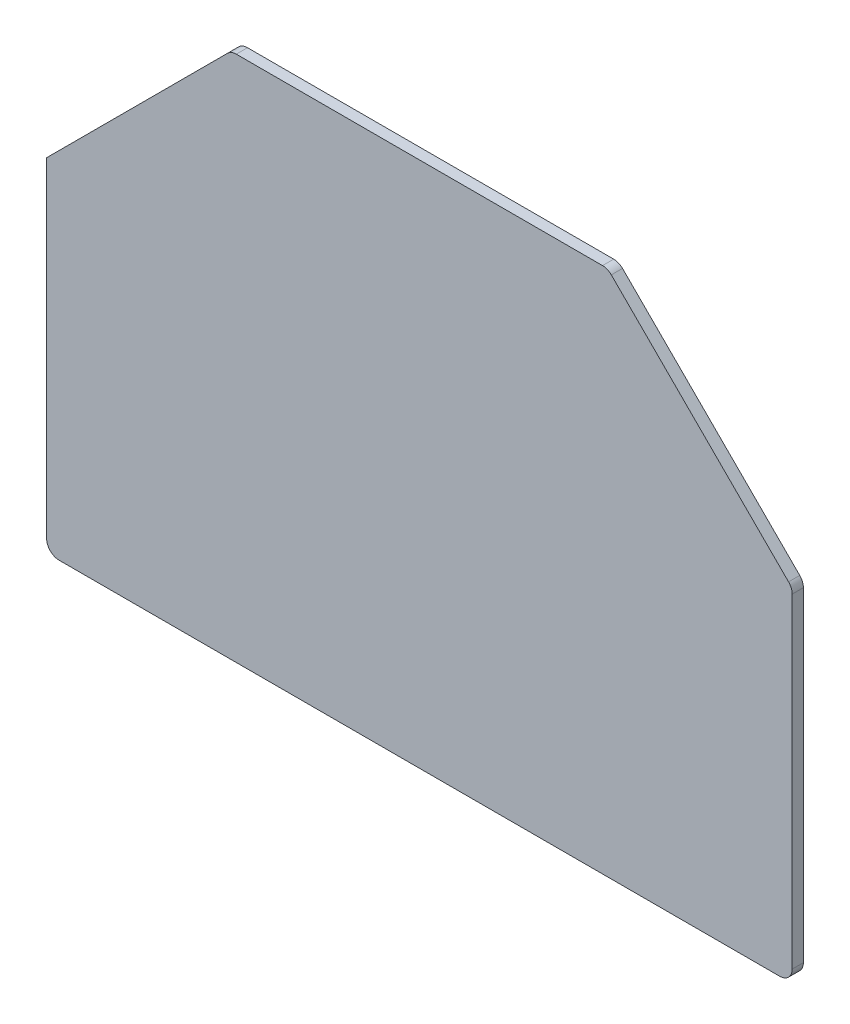
ISO-10303-21;
HEADER;
FILE_DESCRIPTION(('STEP AP214'),'2;1');
FILE_NAME('part.step','',(''),(''),'','','');
FILE_SCHEMA(('AUTOMOTIVE_DESIGN { 1 0 10303 214 1 1 1 1 }'));
ENDSEC;
DATA;
#1=APPLICATION_CONTEXT('core data for automotive mechanical design processes');
#2=APPLICATION_PROTOCOL_DEFINITION('international standard','automotive_design',2000,#1);
#3=PRODUCT_CONTEXT('',#1,'mechanical');
#4=PRODUCT('Part','Part','',(#3));
#5=PRODUCT_RELATED_PRODUCT_CATEGORY('part','',(#4));
#6=PRODUCT_DEFINITION_FORMATION('','',#4);
#7=PRODUCT_DEFINITION_CONTEXT('part definition',#1,'design');
#8=PRODUCT_DEFINITION('design','',#6,#7);
#9=PRODUCT_DEFINITION_SHAPE('','',#8);
#10=(LENGTH_UNIT() NAMED_UNIT(*) SI_UNIT(.MILLI.,.METRE.));
#11=(NAMED_UNIT(*) PLANE_ANGLE_UNIT() SI_UNIT($,.RADIAN.));
#12=(NAMED_UNIT(*) SI_UNIT($,.STERADIAN.) SOLID_ANGLE_UNIT());
#13=UNCERTAINTY_MEASURE_WITH_UNIT(LENGTH_MEASURE(1.E-05),#10,'distance_accuracy_value','');
#14=(GEOMETRIC_REPRESENTATION_CONTEXT(3) GLOBAL_UNCERTAINTY_ASSIGNED_CONTEXT((#13)) GLOBAL_UNIT_ASSIGNED_CONTEXT((#10,
#11,#12)) REPRESENTATION_CONTEXT('',''));
#15=CARTESIAN_POINT('',(0.,0.,0.));
#16=DIRECTION('',(0.,0.,1.));
#17=DIRECTION('',(1.,0.,0.));
#18=AXIS2_PLACEMENT_3D('',#15,#16,#17);
#19=CARTESIAN_POINT('',(0.,0.,4.5));
#20=DIRECTION('',(1.,0.,0.));
#21=DIRECTION('',(0.,0.,-1.));
#22=AXIS2_PLACEMENT_3D('',#19,#20,#21);
#23=PLANE('',#22);
#24=DIRECTION('',(0.,-1.,0.));
#25=VECTOR('',#24,1.);
#26=CARTESIAN_POINT('',(0.,0.,0.));
#27=LINE('',#26,#25);
#28=CARTESIAN_POINT('',(0.,137.753787975412,0.));
#29=VERTEX_POINT('',#28);
#30=CARTESIAN_POINT('',(0.,5.,0.));
#31=VERTEX_POINT('',#30);
#32=EDGE_CURVE('E173',#29,#31,#27,.T.);
#33=ORIENTED_EDGE('',*,*,#32,.T.);
#34=DIRECTION('',(0.,0.,-1.));
#35=VECTOR('',#34,1.);
#36=CARTESIAN_POINT('',(0.,5.,4.5));
#37=LINE('',#36,#35);
#38=CARTESIAN_POINT('',(0.,5.,4.5));
#39=VERTEX_POINT('',#38);
#40=EDGE_CURVE('E152',#31,#39,#37,.F.);
#41=ORIENTED_EDGE('',*,*,#40,.T.);
#42=DIRECTION('',(0.,-1.,0.));
#43=VECTOR('',#42,1.);
#44=CARTESIAN_POINT('',(0.,0.,4.5));
#45=LINE('',#44,#43);
#46=CARTESIAN_POINT('',(0.,137.753787975412,4.5));
#47=VERTEX_POINT('',#46);
#48=EDGE_CURVE('E133',#47,#39,#45,.T.);
#49=ORIENTED_EDGE('',*,*,#48,.F.);
#50=DIRECTION('',(0.,0.,-1.));
#51=VECTOR('',#50,1.);
#52=CARTESIAN_POINT('',(0.,137.753787975412,4.5));
#53=LINE('',#52,#51);
#54=EDGE_CURVE('E138',#47,#29,#53,.T.);
#55=ORIENTED_EDGE('',*,*,#54,.T.);
#56=EDGE_LOOP('',(#33,#41,#49,#55));
#57=FACE_BOUND('',#56,.T.);
#58=ADVANCED_FACE('F45',(#57),#23,.F.);
#59=CARTESIAN_POINT('',(0.,0.,4.5));
#60=DIRECTION('',(0.,1.,0.));
#61=DIRECTION('',(0.,0.,1.));
#62=AXIS2_PLACEMENT_3D('',#59,#60,#61);
#63=PLANE('',#62);
#64=DIRECTION('',(1.,0.,0.));
#65=VECTOR('',#64,1.);
#66=CARTESIAN_POINT('',(0.,0.,4.5));
#67=LINE('',#66,#65);
#68=CARTESIAN_POINT('',(5.,0.,4.5));
#69=VERTEX_POINT('',#68);
#70=CARTESIAN_POINT('',(295.,0.,4.5));
#71=VERTEX_POINT('',#70);
#72=EDGE_CURVE('E154',#69,#71,#67,.T.);
#73=ORIENTED_EDGE('',*,*,#72,.F.);
#74=DIRECTION('',(0.,0.,-1.));
#75=VECTOR('',#74,1.);
#76=CARTESIAN_POINT('',(5.,0.,4.5));
#77=LINE('',#76,#75);
#78=CARTESIAN_POINT('',(5.,0.,0.));
#79=VERTEX_POINT('',#78);
#80=EDGE_CURVE('E192',#69,#79,#77,.T.);
#81=ORIENTED_EDGE('',*,*,#80,.T.);
#82=DIRECTION('',(1.,0.,0.));
#83=VECTOR('',#82,1.);
#84=CARTESIAN_POINT('',(0.,0.,0.));
#85=LINE('',#84,#83);
#86=CARTESIAN_POINT('',(295.,0.,0.));
#87=VERTEX_POINT('',#86);
#88=EDGE_CURVE('E176',#79,#87,#85,.T.);
#89=ORIENTED_EDGE('',*,*,#88,.T.);
#90=DIRECTION('',(0.,0.,-1.));
#91=VECTOR('',#90,1.);
#92=CARTESIAN_POINT('',(295.,0.,4.5));
#93=LINE('',#92,#91);
#94=EDGE_CURVE('E149',#87,#71,#93,.F.);
#95=ORIENTED_EDGE('',*,*,#94,.T.);
#96=EDGE_LOOP('',(#73,#81,#89,#95));
#97=FACE_BOUND('',#96,.T.);
#98=ADVANCED_FACE('F261',(#97),#63,.F.);
#99=CARTESIAN_POINT('',(300.,0.,4.5));
#100=DIRECTION('',(-1.,0.,0.));
#101=DIRECTION('',(0.,0.,1.));
#102=AXIS2_PLACEMENT_3D('',#99,#100,#101);
#103=PLANE('',#102);
#104=DIRECTION('',(0.,1.,0.));
#105=VECTOR('',#104,1.);
#106=CARTESIAN_POINT('',(300.,0.,4.5));
#107=LINE('',#106,#105);
#108=CARTESIAN_POINT('',(300.,5.,4.5));
#109=VERTEX_POINT('',#108);
#110=CARTESIAN_POINT('',(300.,135.682720163547,4.5));
#111=VERTEX_POINT('',#110);
#112=EDGE_CURVE('E159',#109,#111,#107,.T.);
#113=ORIENTED_EDGE('',*,*,#112,.F.);
#114=DIRECTION('',(0.,0.,-1.));
#115=VECTOR('',#114,1.);
#116=CARTESIAN_POINT('',(300.,5.,4.5));
#117=LINE('',#116,#115);
#118=CARTESIAN_POINT('',(300.,5.,0.));
#119=VERTEX_POINT('',#118);
#120=EDGE_CURVE('E230',#109,#119,#117,.T.);
#121=ORIENTED_EDGE('',*,*,#120,.T.);
#122=DIRECTION('',(0.,1.,0.));
#123=VECTOR('',#122,1.);
#124=CARTESIAN_POINT('',(300.,0.,0.));
#125=LINE('',#124,#123);
#126=CARTESIAN_POINT('',(300.,135.682720163547,0.));
#127=VERTEX_POINT('',#126);
#128=EDGE_CURVE('E180',#119,#127,#125,.T.);
#129=ORIENTED_EDGE('',*,*,#128,.T.);
#130=DIRECTION('',(0.,0.,-1.));
#131=VECTOR('',#130,1.);
#132=CARTESIAN_POINT('',(300.,135.682720163547,4.5));
#133=LINE('',#132,#131);
#134=EDGE_CURVE('E227',#127,#111,#133,.F.);
#135=ORIENTED_EDGE('',*,*,#134,.T.);
#136=EDGE_LOOP('',(#113,#121,#129,#135));
#137=FACE_BOUND('',#136,.T.);
#138=ADVANCED_FACE('F266',(#137),#103,.F.);
#139=CARTESIAN_POINT('',(225.753787975413,212.,4.5));
#140=DIRECTION('',(-0.707106781186549,-0.707106781186546,0.));
#141=DIRECTION('',(0.707106781186546,-0.707106781186549,0.));
#142=AXIS2_PLACEMENT_3D('',#139,#140,#141);
#143=PLANE('',#142);
#144=DIRECTION('',(-0.707106781186546,0.707106781186549,0.));
#145=VECTOR('',#144,1.);
#146=CARTESIAN_POINT('',(225.753787975413,212.,4.5));
#147=LINE('',#146,#145);
#148=CARTESIAN_POINT('',(298.535533905933,139.21825406948,4.5));
#149=VERTEX_POINT('',#148);
#150=CARTESIAN_POINT('',(227.21825406948,210.535533905933,4.5));
#151=VERTEX_POINT('',#150);
#152=EDGE_CURVE('E167',#149,#151,#147,.T.);
#153=ORIENTED_EDGE('',*,*,#152,.F.);
#154=DIRECTION('',(0.,0.,-1.));
#155=VECTOR('',#154,1.);
#156=CARTESIAN_POINT('',(298.535533905933,139.21825406948,4.5));
#157=LINE('',#156,#155);
#158=CARTESIAN_POINT('',(298.535533905933,139.21825406948,0.));
#159=VERTEX_POINT('',#158);
#160=EDGE_CURVE('E237',#149,#159,#157,.T.);
#161=ORIENTED_EDGE('',*,*,#160,.T.);
#162=DIRECTION('',(-0.707106781186546,0.707106781186549,0.));
#163=VECTOR('',#162,1.);
#164=CARTESIAN_POINT('',(225.753787975413,212.,0.));
#165=LINE('',#164,#163);
#166=CARTESIAN_POINT('',(227.21825406948,210.535533905933,0.));
#167=VERTEX_POINT('',#166);
#168=EDGE_CURVE('E184',#159,#167,#165,.T.);
#169=ORIENTED_EDGE('',*,*,#168,.T.);
#170=DIRECTION('',(0.,0.,-1.));
#171=VECTOR('',#170,1.);
#172=CARTESIAN_POINT('',(227.21825406948,210.535533905933,4.5));
#173=LINE('',#172,#171);
#174=EDGE_CURVE('E234',#167,#151,#173,.F.);
#175=ORIENTED_EDGE('',*,*,#174,.T.);
#176=EDGE_LOOP('',(#153,#161,#169,#175));
#177=FACE_BOUND('',#176,.T.);
#178=ADVANCED_FACE('F289',(#177),#143,.F.);
#179=CARTESIAN_POINT('',(74.2462120245874,212.,4.5));
#180=DIRECTION('',(0.,-1.,0.));
#181=DIRECTION('',(1.,0.,0.));
#182=AXIS2_PLACEMENT_3D('',#179,#180,#181);
#183=PLANE('',#182);
#184=DIRECTION('',(-1.,0.,0.));
#185=VECTOR('',#184,1.);
#186=CARTESIAN_POINT('',(74.2462120245874,212.,4.5));
#187=LINE('',#186,#185);
#188=CARTESIAN_POINT('',(223.682720163547,212.,4.5));
#189=VERTEX_POINT('',#188);
#190=CARTESIAN_POINT('',(76.3172798364529,212.,4.5));
#191=VERTEX_POINT('',#190);
#192=EDGE_CURVE('E139',#189,#191,#187,.T.);
#193=ORIENTED_EDGE('',*,*,#192,.F.);
#194=DIRECTION('',(0.,0.,-1.));
#195=VECTOR('',#194,1.);
#196=CARTESIAN_POINT('',(223.682720163547,212.,4.5));
#197=LINE('',#196,#195);
#198=CARTESIAN_POINT('',(223.682720163547,212.,0.));
#199=VERTEX_POINT('',#198);
#200=EDGE_CURVE('E54',#189,#199,#197,.T.);
#201=ORIENTED_EDGE('',*,*,#200,.T.);
#202=DIRECTION('',(-1.,0.,0.));
#203=VECTOR('',#202,1.);
#204=CARTESIAN_POINT('',(74.2462120245874,212.,0.));
#205=LINE('',#204,#203);
#206=CARTESIAN_POINT('',(76.3172798364529,212.,0.));
#207=VERTEX_POINT('',#206);
#208=EDGE_CURVE('E161',#199,#207,#205,.T.);
#209=ORIENTED_EDGE('',*,*,#208,.T.);
#210=DIRECTION('',(0.,0.,-1.));
#211=VECTOR('',#210,1.);
#212=CARTESIAN_POINT('',(76.3172798364529,212.,4.5));
#213=LINE('',#212,#211);
#214=EDGE_CURVE('E69',#207,#191,#213,.F.);
#215=ORIENTED_EDGE('',*,*,#214,.T.);
#216=EDGE_LOOP('',(#193,#201,#209,#215));
#217=FACE_BOUND('',#216,.T.);
#218=ADVANCED_FACE('F246',(#217),#183,.F.);
#219=CARTESIAN_POINT('',(0.,137.753787975412,4.5));
#220=DIRECTION('',(0.707106781186549,-0.707106781186547,0.));
#221=DIRECTION('',(0.707106781186547,0.707106781186549,0.));
#222=AXIS2_PLACEMENT_3D('',#219,#220,#221);
#223=PLANE('',#222);
#224=DIRECTION('',(-0.707106781186546,-0.707106781186548,0.));
#225=VECTOR('',#224,1.);
#226=CARTESIAN_POINT('',(0.,137.753787975412,4.5));
#227=LINE('',#226,#225);
#228=CARTESIAN_POINT('',(72.7817459305201,210.535533905933,4.5));
#229=VERTEX_POINT('',#228);
#230=EDGE_CURVE('E129',#229,#47,#227,.T.);
#231=ORIENTED_EDGE('',*,*,#230,.F.);
#232=DIRECTION('',(0.,0.,-1.));
#233=VECTOR('',#232,1.);
#234=CARTESIAN_POINT('',(72.7817459305201,210.535533905933,4.5));
#235=LINE('',#234,#233);
#236=CARTESIAN_POINT('',(72.7817459305201,210.535533905933,0.));
#237=VERTEX_POINT('',#236);
#238=EDGE_CURVE('E11',#229,#237,#235,.T.);
#239=ORIENTED_EDGE('',*,*,#238,.T.);
#240=DIRECTION('',(-0.707106781186546,-0.707106781186548,0.));
#241=VECTOR('',#240,1.);
#242=CARTESIAN_POINT('',(0.,137.753787975412,0.));
#243=LINE('',#242,#241);
#244=EDGE_CURVE('E144',#237,#29,#243,.T.);
#245=ORIENTED_EDGE('',*,*,#244,.T.);
#246=ORIENTED_EDGE('',*,*,#54,.F.);
#247=EDGE_LOOP('',(#231,#239,#245,#246));
#248=FACE_BOUND('',#247,.T.);
#249=ADVANCED_FACE('F142',(#248),#223,.F.);
#250=CARTESIAN_POINT('',(0.,0.,4.5));
#251=DIRECTION('',(0.,0.,-1.));
#252=DIRECTION('',(-1.,0.,0.));
#253=AXIS2_PLACEMENT_3D('',#250,#251,#252);
#254=PLANE('',#253);
#255=ORIENTED_EDGE('',*,*,#48,.T.);
#256=CARTESIAN_POINT('',(5.,5.,4.5));
#257=DIRECTION('',(0.,0.,-1.));
#258=DIRECTION('',(-1.,0.,0.));
#259=AXIS2_PLACEMENT_3D('',#256,#257,#258);
#260=CIRCLE('',#259,5.);
#261=EDGE_CURVE('E224',#39,#69,#260,.F.);
#262=ORIENTED_EDGE('',*,*,#261,.T.);
#263=ORIENTED_EDGE('',*,*,#72,.T.);
#264=CARTESIAN_POINT('',(295.,5.,4.5));
#265=DIRECTION('',(0.,0.,-1.));
#266=DIRECTION('',(-1.,0.,0.));
#267=AXIS2_PLACEMENT_3D('',#264,#265,#266);
#268=CIRCLE('',#267,5.);
#269=EDGE_CURVE('E221',#71,#109,#268,.F.);
#270=ORIENTED_EDGE('',*,*,#269,.T.);
#271=ORIENTED_EDGE('',*,*,#112,.T.);
#272=CARTESIAN_POINT('',(295.,135.682720163547,4.5));
#273=DIRECTION('',(0.,0.,-1.));
#274=DIRECTION('',(-1.,0.,0.));
#275=AXIS2_PLACEMENT_3D('',#272,#273,#274);
#276=CIRCLE('',#275,5.);
#277=EDGE_CURVE('E218',#111,#149,#276,.F.);
#278=ORIENTED_EDGE('',*,*,#277,.T.);
#279=ORIENTED_EDGE('',*,*,#152,.T.);
#280=CARTESIAN_POINT('',(223.682720163547,207.,4.5));
#281=DIRECTION('',(0.,0.,-1.));
#282=DIRECTION('',(-1.,0.,0.));
#283=AXIS2_PLACEMENT_3D('',#280,#281,#282);
#284=CIRCLE('',#283,5.);
#285=EDGE_CURVE('E215',#151,#189,#284,.F.);
#286=ORIENTED_EDGE('',*,*,#285,.T.);
#287=ORIENTED_EDGE('',*,*,#192,.T.);
#288=CARTESIAN_POINT('',(76.3172798364529,207.,4.5));
#289=DIRECTION('',(0.,0.,-1.));
#290=DIRECTION('',(-1.,0.,0.));
#291=AXIS2_PLACEMENT_3D('',#288,#289,#290);
#292=CIRCLE('',#291,5.);
#293=EDGE_CURVE('E61',#191,#229,#292,.F.);
#294=ORIENTED_EDGE('',*,*,#293,.T.);
#295=ORIENTED_EDGE('',*,*,#230,.T.);
#296=EDGE_LOOP('',(#255,#262,#263,#270,#271,#278,#279,#286,#287,#294,#295));
#297=FACE_BOUND('',#296,.T.);
#298=ADVANCED_FACE('F131',(#297),#254,.F.);
#299=CARTESIAN_POINT('',(0.,0.,0.));
#300=DIRECTION('',(0.,0.,-1.));
#301=DIRECTION('',(-1.,0.,0.));
#302=AXIS2_PLACEMENT_3D('',#299,#300,#301);
#303=PLANE('',#302);
#304=ORIENTED_EDGE('',*,*,#88,.F.);
#305=CARTESIAN_POINT('',(5.,5.,0.));
#306=DIRECTION('',(0.,0.,-1.));
#307=DIRECTION('',(-1.,0.,0.));
#308=AXIS2_PLACEMENT_3D('',#305,#306,#307);
#309=CIRCLE('',#308,5.);
#310=EDGE_CURVE('E208',#79,#31,#309,.T.);
#311=ORIENTED_EDGE('',*,*,#310,.T.);
#312=ORIENTED_EDGE('',*,*,#32,.F.);
#313=ORIENTED_EDGE('',*,*,#244,.F.);
#314=CARTESIAN_POINT('',(76.3172798364529,207.,0.));
#315=DIRECTION('',(0.,0.,-1.));
#316=DIRECTION('',(-1.,0.,0.));
#317=AXIS2_PLACEMENT_3D('',#314,#315,#316);
#318=CIRCLE('',#317,5.);
#319=EDGE_CURVE('E196',#237,#207,#318,.T.);
#320=ORIENTED_EDGE('',*,*,#319,.T.);
#321=ORIENTED_EDGE('',*,*,#208,.F.);
#322=CARTESIAN_POINT('',(223.682720163547,207.,0.));
#323=DIRECTION('',(0.,0.,-1.));
#324=DIRECTION('',(-1.,0.,0.));
#325=AXIS2_PLACEMENT_3D('',#322,#323,#324);
#326=CIRCLE('',#325,5.);
#327=EDGE_CURVE('E199',#199,#167,#326,.T.);
#328=ORIENTED_EDGE('',*,*,#327,.T.);
#329=ORIENTED_EDGE('',*,*,#168,.F.);
#330=CARTESIAN_POINT('',(295.,135.682720163547,0.));
#331=DIRECTION('',(0.,0.,-1.));
#332=DIRECTION('',(-1.,0.,0.));
#333=AXIS2_PLACEMENT_3D('',#330,#331,#332);
#334=CIRCLE('',#333,5.);
#335=EDGE_CURVE('E202',#159,#127,#334,.T.);
#336=ORIENTED_EDGE('',*,*,#335,.T.);
#337=ORIENTED_EDGE('',*,*,#128,.F.);
#338=CARTESIAN_POINT('',(295.,5.,0.));
#339=DIRECTION('',(0.,0.,-1.));
#340=DIRECTION('',(-1.,0.,0.));
#341=AXIS2_PLACEMENT_3D('',#338,#339,#340);
#342=CIRCLE('',#341,5.);
#343=EDGE_CURVE('E205',#119,#87,#342,.T.);
#344=ORIENTED_EDGE('',*,*,#343,.T.);
#345=EDGE_LOOP('',(#304,#311,#312,#313,#320,#321,#328,#329,#336,#337,#344));
#346=FACE_BOUND('',#345,.T.);
#347=ADVANCED_FACE('F251',(#346),#303,.T.);
#348=CARTESIAN_POINT('',(5.,5.,4.5));
#349=DIRECTION('',(0.,0.,-1.));
#350=DIRECTION('',(-1.,0.,0.));
#351=AXIS2_PLACEMENT_3D('',#348,#349,#350);
#352=CYLINDRICAL_SURFACE('',#351,5.);
#353=ORIENTED_EDGE('',*,*,#261,.F.);
#354=ORIENTED_EDGE('',*,*,#40,.F.);
#355=ORIENTED_EDGE('',*,*,#310,.F.);
#356=ORIENTED_EDGE('',*,*,#80,.F.);
#357=EDGE_LOOP('',(#353,#354,#355,#356));
#358=FACE_BOUND('',#357,.T.);
#359=ADVANCED_FACE('F271',(#358),#352,.T.);
#360=CARTESIAN_POINT('',(295.,5.,4.5));
#361=DIRECTION('',(0.,0.,-1.));
#362=DIRECTION('',(-1.,0.,0.));
#363=AXIS2_PLACEMENT_3D('',#360,#361,#362);
#364=CYLINDRICAL_SURFACE('',#363,5.);
#365=ORIENTED_EDGE('',*,*,#269,.F.);
#366=ORIENTED_EDGE('',*,*,#94,.F.);
#367=ORIENTED_EDGE('',*,*,#343,.F.);
#368=ORIENTED_EDGE('',*,*,#120,.F.);
#369=EDGE_LOOP('',(#365,#366,#367,#368));
#370=FACE_BOUND('',#369,.T.);
#371=ADVANCED_FACE('F274',(#370),#364,.T.);
#372=CARTESIAN_POINT('',(295.,135.682720163547,4.5));
#373=DIRECTION('',(0.,0.,-1.));
#374=DIRECTION('',(-1.,0.,0.));
#375=AXIS2_PLACEMENT_3D('',#372,#373,#374);
#376=CYLINDRICAL_SURFACE('',#375,5.);
#377=ORIENTED_EDGE('',*,*,#277,.F.);
#378=ORIENTED_EDGE('',*,*,#134,.F.);
#379=ORIENTED_EDGE('',*,*,#335,.F.);
#380=ORIENTED_EDGE('',*,*,#160,.F.);
#381=EDGE_LOOP('',(#377,#378,#379,#380));
#382=FACE_BOUND('',#381,.T.);
#383=ADVANCED_FACE('F259',(#382),#376,.T.);
#384=CARTESIAN_POINT('',(223.682720163547,207.,4.5));
#385=DIRECTION('',(0.,0.,-1.));
#386=DIRECTION('',(-1.,0.,0.));
#387=AXIS2_PLACEMENT_3D('',#384,#385,#386);
#388=CYLINDRICAL_SURFACE('',#387,5.);
#389=ORIENTED_EDGE('',*,*,#285,.F.);
#390=ORIENTED_EDGE('',*,*,#174,.F.);
#391=ORIENTED_EDGE('',*,*,#327,.F.);
#392=ORIENTED_EDGE('',*,*,#200,.F.);
#393=EDGE_LOOP('',(#389,#390,#391,#392));
#394=FACE_BOUND('',#393,.T.);
#395=ADVANCED_FACE('F255',(#394),#388,.T.);
#396=CARTESIAN_POINT('',(76.3172798364529,207.,4.5));
#397=DIRECTION('',(0.,0.,-1.));
#398=DIRECTION('',(-1.,0.,0.));
#399=AXIS2_PLACEMENT_3D('',#396,#397,#398);
#400=CYLINDRICAL_SURFACE('',#399,5.);
#401=ORIENTED_EDGE('',*,*,#293,.F.);
#402=ORIENTED_EDGE('',*,*,#214,.F.);
#403=ORIENTED_EDGE('',*,*,#319,.F.);
#404=ORIENTED_EDGE('',*,*,#238,.F.);
#405=EDGE_LOOP('',(#401,#402,#403,#404));
#406=FACE_BOUND('',#405,.T.);
#407=ADVANCED_FACE('F47',(#406),#400,.T.);
#408=CLOSED_SHELL('',(#58,#98,#138,#178,#218,#249,#298,#347,#359,#371,#383,#395,#407));
#409=MANIFOLD_SOLID_BREP('B2',#408);
#410=ADVANCED_BREP_SHAPE_REPRESENTATION('',(#18,#409),#14);
#411=SHAPE_DEFINITION_REPRESENTATION(#9,#410);
ENDSEC;
END-ISO-10303-21;
